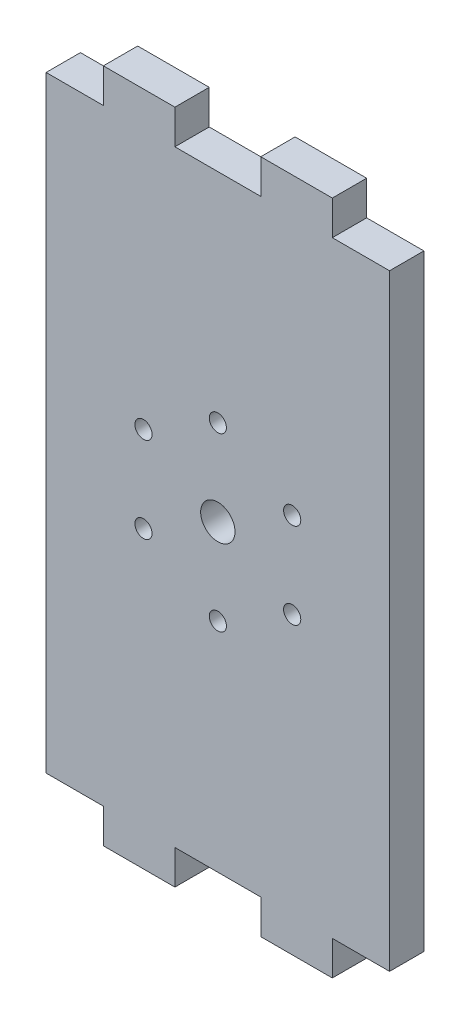
ISO-10303-21;
HEADER;
FILE_DESCRIPTION(('STEP AP214'),'2;1');
FILE_NAME('part.step','',(''),(''),'','','');
FILE_SCHEMA(('AUTOMOTIVE_DESIGN { 1 0 10303 214 1 1 1 1 }'));
ENDSEC;
DATA;
#1=APPLICATION_CONTEXT('core data for automotive mechanical design processes');
#2=APPLICATION_PROTOCOL_DEFINITION('international standard','automotive_design',2000,#1);
#3=PRODUCT_CONTEXT('',#1,'mechanical');
#4=PRODUCT('Part','Part','',(#3));
#5=PRODUCT_RELATED_PRODUCT_CATEGORY('part','',(#4));
#6=PRODUCT_DEFINITION_FORMATION('','',#4);
#7=PRODUCT_DEFINITION_CONTEXT('part definition',#1,'design');
#8=PRODUCT_DEFINITION('design','',#6,#7);
#9=PRODUCT_DEFINITION_SHAPE('','',#8);
#10=(LENGTH_UNIT() NAMED_UNIT(*) SI_UNIT(.MILLI.,.METRE.));
#11=(NAMED_UNIT(*) PLANE_ANGLE_UNIT() SI_UNIT($,.RADIAN.));
#12=(NAMED_UNIT(*) SI_UNIT($,.STERADIAN.) SOLID_ANGLE_UNIT());
#13=UNCERTAINTY_MEASURE_WITH_UNIT(LENGTH_MEASURE(1.E-05),#10,'distance_accuracy_value','');
#14=(GEOMETRIC_REPRESENTATION_CONTEXT(3) GLOBAL_UNCERTAINTY_ASSIGNED_CONTEXT((#13)) GLOBAL_UNIT_ASSIGNED_CONTEXT((#10,
#11,#12)) REPRESENTATION_CONTEXT('',''));
#15=CARTESIAN_POINT('',(0.,0.,0.));
#16=DIRECTION('',(0.,0.,1.));
#17=DIRECTION('',(1.,0.,0.));
#18=AXIS2_PLACEMENT_3D('',#15,#16,#17);
#19=CARTESIAN_POINT('',(0.,0.,3.));
#20=DIRECTION('',(0.,0.,1.));
#21=DIRECTION('',(1.,0.,0.));
#22=AXIS2_PLACEMENT_3D('',#19,#20,#21);
#23=PLANE('',#22);
#24=CARTESIAN_POINT('',(-6.49519052838329,-3.75,3.));
#25=DIRECTION('',(0.,0.,1.));
#26=DIRECTION('',(1.,0.,0.));
#27=AXIS2_PLACEMENT_3D('',#24,#25,#26);
#28=CIRCLE('',#27,0.750000000000066);
#29=CARTESIAN_POINT('',(-5.74519052838322,-3.75,3.));
#30=VERTEX_POINT('',#29);
#31=EDGE_CURVE('E406',#30,#30,#28,.T.);
#32=ORIENTED_EDGE('',*,*,#31,.F.);
#33=EDGE_LOOP('',(#32));
#34=FACE_BOUND('',#33,.T.);
#35=CARTESIAN_POINT('',(6.4951905283833,-3.74999999999999,3.));
#36=DIRECTION('',(0.,0.,1.));
#37=DIRECTION('',(1.,0.,0.));
#38=AXIS2_PLACEMENT_3D('',#35,#36,#37);
#39=CIRCLE('',#38,0.750000000000002);
#40=CARTESIAN_POINT('',(7.2451905283833,-3.74999999999999,3.));
#41=VERTEX_POINT('',#40);
#42=EDGE_CURVE('E418',#41,#41,#39,.T.);
#43=ORIENTED_EDGE('',*,*,#42,.F.);
#44=EDGE_LOOP('',(#43));
#45=FACE_BOUND('',#44,.T.);
#46=CARTESIAN_POINT('',(0.,0.,3.));
#47=DIRECTION('',(0.,0.,1.));
#48=DIRECTION('',(1.,0.,0.));
#49=AXIS2_PLACEMENT_3D('',#46,#47,#48);
#50=CIRCLE('',#49,1.5);
#51=CARTESIAN_POINT('',(1.5,0.,3.));
#52=VERTEX_POINT('',#51);
#53=EDGE_CURVE('E430',#52,#52,#50,.T.);
#54=ORIENTED_EDGE('',*,*,#53,.F.);
#55=EDGE_LOOP('',(#54));
#56=FACE_BOUND('',#55,.T.);
#57=DIRECTION('',(0.,-1.,0.));
#58=VECTOR('',#57,1.);
#59=CARTESIAN_POINT('',(-15.,26.5,3.));
#60=LINE('',#59,#58);
#61=CARTESIAN_POINT('',(-15.,26.5,3.));
#62=VERTEX_POINT('',#61);
#63=CARTESIAN_POINT('',(-15.,-26.5,3.));
#64=VERTEX_POINT('',#63);
#65=EDGE_CURVE('E240',#62,#64,#60,.T.);
#66=ORIENTED_EDGE('',*,*,#65,.T.);
#67=DIRECTION('',(1.,0.,0.));
#68=VECTOR('',#67,1.);
#69=CARTESIAN_POINT('',(-15.,-26.5,3.));
#70=LINE('',#69,#68);
#71=CARTESIAN_POINT('',(-10.,-26.5,3.));
#72=VERTEX_POINT('',#71);
#73=EDGE_CURVE('E128',#64,#72,#70,.T.);
#74=ORIENTED_EDGE('',*,*,#73,.T.);
#75=DIRECTION('',(0.,-1.,0.));
#76=VECTOR('',#75,1.);
#77=CARTESIAN_POINT('',(-10.,-26.5,3.));
#78=LINE('',#77,#76);
#79=CARTESIAN_POINT('',(-10.,-29.5,3.));
#80=VERTEX_POINT('',#79);
#81=EDGE_CURVE('E291',#72,#80,#78,.T.);
#82=ORIENTED_EDGE('',*,*,#81,.T.);
#83=DIRECTION('',(1.,0.,0.));
#84=VECTOR('',#83,1.);
#85=CARTESIAN_POINT('',(-10.,-29.5,3.));
#86=LINE('',#85,#84);
#87=CARTESIAN_POINT('',(-3.75,-29.5,3.));
#88=VERTEX_POINT('',#87);
#89=EDGE_CURVE('E310',#80,#88,#86,.T.);
#90=ORIENTED_EDGE('',*,*,#89,.T.);
#91=DIRECTION('',(0.,1.,0.));
#92=VECTOR('',#91,1.);
#93=CARTESIAN_POINT('',(-3.75,-29.5,3.));
#94=LINE('',#93,#92);
#95=CARTESIAN_POINT('',(-3.75,-26.5,3.));
#96=VERTEX_POINT('',#95);
#97=EDGE_CURVE('E307',#88,#96,#94,.T.);
#98=ORIENTED_EDGE('',*,*,#97,.T.);
#99=DIRECTION('',(1.,0.,0.));
#100=VECTOR('',#99,1.);
#101=CARTESIAN_POINT('',(-3.75,-26.5,3.));
#102=LINE('',#101,#100);
#103=CARTESIAN_POINT('',(3.75,-26.5,3.));
#104=VERTEX_POINT('',#103);
#105=EDGE_CURVE('E309',#96,#104,#102,.T.);
#106=ORIENTED_EDGE('',*,*,#105,.T.);
#107=DIRECTION('',(0.,-1.,0.));
#108=VECTOR('',#107,1.);
#109=CARTESIAN_POINT('',(3.75,-26.5,3.));
#110=LINE('',#109,#108);
#111=CARTESIAN_POINT('',(3.75,-29.5,3.));
#112=VERTEX_POINT('',#111);
#113=EDGE_CURVE('E312',#104,#112,#110,.T.);
#114=ORIENTED_EDGE('',*,*,#113,.T.);
#115=DIRECTION('',(1.,0.,0.));
#116=VECTOR('',#115,1.);
#117=CARTESIAN_POINT('',(3.75,-29.5,3.));
#118=LINE('',#117,#116);
#119=CARTESIAN_POINT('',(10.,-29.5,3.));
#120=VERTEX_POINT('',#119);
#121=EDGE_CURVE('E318',#112,#120,#118,.T.);
#122=ORIENTED_EDGE('',*,*,#121,.T.);
#123=DIRECTION('',(0.,1.,0.));
#124=VECTOR('',#123,1.);
#125=CARTESIAN_POINT('',(10.,-29.5,3.));
#126=LINE('',#125,#124);
#127=CARTESIAN_POINT('',(10.,-26.5,3.));
#128=VERTEX_POINT('',#127);
#129=EDGE_CURVE('E320',#120,#128,#126,.T.);
#130=ORIENTED_EDGE('',*,*,#129,.T.);
#131=DIRECTION('',(1.,0.,0.));
#132=VECTOR('',#131,1.);
#133=CARTESIAN_POINT('',(10.,-26.5,3.));
#134=LINE('',#133,#132);
#135=CARTESIAN_POINT('',(15.,-26.5,3.));
#136=VERTEX_POINT('',#135);
#137=EDGE_CURVE('E322',#128,#136,#134,.T.);
#138=ORIENTED_EDGE('',*,*,#137,.T.);
#139=DIRECTION('',(0.,1.,0.));
#140=VECTOR('',#139,1.);
#141=CARTESIAN_POINT('',(15.,26.5,3.));
#142=LINE('',#141,#140);
#143=CARTESIAN_POINT('',(15.,26.5,3.));
#144=VERTEX_POINT('',#143);
#145=EDGE_CURVE('E324',#136,#144,#142,.T.);
#146=ORIENTED_EDGE('',*,*,#145,.T.);
#147=DIRECTION('',(-1.,0.,0.));
#148=VECTOR('',#147,1.);
#149=CARTESIAN_POINT('',(10.,26.5,3.));
#150=LINE('',#149,#148);
#151=CARTESIAN_POINT('',(10.,26.5,3.));
#152=VERTEX_POINT('',#151);
#153=EDGE_CURVE('E326',#144,#152,#150,.T.);
#154=ORIENTED_EDGE('',*,*,#153,.T.);
#155=DIRECTION('',(0.,1.,0.));
#156=VECTOR('',#155,1.);
#157=CARTESIAN_POINT('',(10.,29.5,3.));
#158=LINE('',#157,#156);
#159=CARTESIAN_POINT('',(10.,29.5,3.));
#160=VERTEX_POINT('',#159);
#161=EDGE_CURVE('E328',#152,#160,#158,.T.);
#162=ORIENTED_EDGE('',*,*,#161,.T.);
#163=DIRECTION('',(-1.,0.,0.));
#164=VECTOR('',#163,1.);
#165=CARTESIAN_POINT('',(3.75,29.5,3.));
#166=LINE('',#165,#164);
#167=CARTESIAN_POINT('',(3.75,29.5,3.));
#168=VERTEX_POINT('',#167);
#169=EDGE_CURVE('E330',#160,#168,#166,.T.);
#170=ORIENTED_EDGE('',*,*,#169,.T.);
#171=DIRECTION('',(0.,-1.,0.));
#172=VECTOR('',#171,1.);
#173=CARTESIAN_POINT('',(3.75,26.5,3.));
#174=LINE('',#173,#172);
#175=CARTESIAN_POINT('',(3.75,26.5,3.));
#176=VERTEX_POINT('',#175);
#177=EDGE_CURVE('E332',#168,#176,#174,.T.);
#178=ORIENTED_EDGE('',*,*,#177,.T.);
#179=DIRECTION('',(-1.,0.,0.));
#180=VECTOR('',#179,1.);
#181=CARTESIAN_POINT('',(-3.75,26.5,3.));
#182=LINE('',#181,#180);
#183=CARTESIAN_POINT('',(-3.75,26.5,3.));
#184=VERTEX_POINT('',#183);
#185=EDGE_CURVE('E334',#176,#184,#182,.T.);
#186=ORIENTED_EDGE('',*,*,#185,.T.);
#187=DIRECTION('',(0.,1.,0.));
#188=VECTOR('',#187,1.);
#189=CARTESIAN_POINT('',(-3.75,29.5,3.));
#190=LINE('',#189,#188);
#191=CARTESIAN_POINT('',(-3.75,29.5,3.));
#192=VERTEX_POINT('',#191);
#193=EDGE_CURVE('E183',#184,#192,#190,.T.);
#194=ORIENTED_EDGE('',*,*,#193,.T.);
#195=DIRECTION('',(-1.,0.,0.));
#196=VECTOR('',#195,1.);
#197=CARTESIAN_POINT('',(-10.,29.5,3.));
#198=LINE('',#197,#196);
#199=CARTESIAN_POINT('',(-10.,29.5,3.));
#200=VERTEX_POINT('',#199);
#201=EDGE_CURVE('E177',#192,#200,#198,.T.);
#202=ORIENTED_EDGE('',*,*,#201,.T.);
#203=DIRECTION('',(0.,-1.,0.));
#204=VECTOR('',#203,1.);
#205=CARTESIAN_POINT('',(-10.,26.5,3.));
#206=LINE('',#205,#204);
#207=CARTESIAN_POINT('',(-10.,26.5,3.));
#208=VERTEX_POINT('',#207);
#209=EDGE_CURVE('E181',#200,#208,#206,.T.);
#210=ORIENTED_EDGE('',*,*,#209,.T.);
#211=DIRECTION('',(-1.,0.,0.));
#212=VECTOR('',#211,1.);
#213=CARTESIAN_POINT('',(-15.,26.5,3.));
#214=LINE('',#213,#212);
#215=EDGE_CURVE('E49',#208,#62,#214,.T.);
#216=ORIENTED_EDGE('',*,*,#215,.T.);
#217=EDGE_LOOP('',(#66,#74,#82,#90,#98,#106,#114,#122,#130,#138,#146,#154,#162,#170,#178,#186,
#194,#202,#210,#216));
#218=FACE_BOUND('',#217,.T.);
#219=CARTESIAN_POINT('',(0.,7.5,3.));
#220=DIRECTION('',(0.,0.,1.));
#221=DIRECTION('',(1.,0.,0.));
#222=AXIS2_PLACEMENT_3D('',#219,#220,#221);
#223=CIRCLE('',#222,0.750000000000086);
#224=CARTESIAN_POINT('',(0.750000000000086,7.5,3.));
#225=VERTEX_POINT('',#224);
#226=EDGE_CURVE('E205',#225,#225,#223,.T.);
#227=ORIENTED_EDGE('',*,*,#226,.F.);
#228=EDGE_LOOP('',(#227));
#229=FACE_BOUND('',#228,.T.);
#230=CARTESIAN_POINT('',(6.49519052838329,3.75000000000001,3.));
#231=DIRECTION('',(0.,0.,1.));
#232=DIRECTION('',(1.,0.,0.));
#233=AXIS2_PLACEMENT_3D('',#230,#231,#232);
#234=CIRCLE('',#233,0.750000000000064);
#235=CARTESIAN_POINT('',(7.24519052838335,3.75000000000001,3.));
#236=VERTEX_POINT('',#235);
#237=EDGE_CURVE('E424',#236,#236,#234,.T.);
#238=ORIENTED_EDGE('',*,*,#237,.F.);
#239=EDGE_LOOP('',(#238));
#240=FACE_BOUND('',#239,.T.);
#241=CARTESIAN_POINT('',(0.,-7.5,3.));
#242=DIRECTION('',(0.,0.,1.));
#243=DIRECTION('',(1.,0.,0.));
#244=AXIS2_PLACEMENT_3D('',#241,#242,#243);
#245=CIRCLE('',#244,0.750000000000001);
#246=CARTESIAN_POINT('',(0.750000000000024,-7.5,3.));
#247=VERTEX_POINT('',#246);
#248=EDGE_CURVE('E412',#247,#247,#245,.T.);
#249=ORIENTED_EDGE('',*,*,#248,.F.);
#250=EDGE_LOOP('',(#249));
#251=FACE_BOUND('',#250,.T.);
#252=CARTESIAN_POINT('',(-6.49519052838329,3.74999999999999,3.));
#253=DIRECTION('',(0.,0.,1.));
#254=DIRECTION('',(1.,0.,0.));
#255=AXIS2_PLACEMENT_3D('',#252,#253,#254);
#256=CIRCLE('',#255,0.750000000000002);
#257=CARTESIAN_POINT('',(-5.74519052838329,3.74999999999999,3.));
#258=VERTEX_POINT('',#257);
#259=EDGE_CURVE('E397',#258,#258,#256,.T.);
#260=ORIENTED_EDGE('',*,*,#259,.F.);
#261=EDGE_LOOP('',(#260));
#262=FACE_BOUND('',#261,.T.);
#263=ADVANCED_FACE('F32',(#34,#45,#56,#218,#229,#240,#251,#262),#23,.T.);
#264=CARTESIAN_POINT('',(0.,0.,0.));
#265=DIRECTION('',(0.,0.,1.));
#266=DIRECTION('',(1.,0.,0.));
#267=AXIS2_PLACEMENT_3D('',#264,#265,#266);
#268=PLANE('',#267);
#269=DIRECTION('',(0.,-1.,0.));
#270=VECTOR('',#269,1.);
#271=CARTESIAN_POINT('',(-15.,26.5,0.));
#272=LINE('',#271,#270);
#273=CARTESIAN_POINT('',(-15.,26.5,0.));
#274=VERTEX_POINT('',#273);
#275=CARTESIAN_POINT('',(-15.,-26.5,0.));
#276=VERTEX_POINT('',#275);
#277=EDGE_CURVE('E201',#274,#276,#272,.T.);
#278=ORIENTED_EDGE('',*,*,#277,.F.);
#279=DIRECTION('',(-1.,0.,0.));
#280=VECTOR('',#279,1.);
#281=CARTESIAN_POINT('',(-15.,26.5,0.));
#282=LINE('',#281,#280);
#283=CARTESIAN_POINT('',(-10.,26.5,0.));
#284=VERTEX_POINT('',#283);
#285=EDGE_CURVE('E120',#284,#274,#282,.T.);
#286=ORIENTED_EDGE('',*,*,#285,.F.);
#287=DIRECTION('',(0.,-1.,0.));
#288=VECTOR('',#287,1.);
#289=CARTESIAN_POINT('',(-10.,26.5,0.));
#290=LINE('',#289,#288);
#291=CARTESIAN_POINT('',(-10.,29.5,0.));
#292=VERTEX_POINT('',#291);
#293=EDGE_CURVE('E114',#292,#284,#290,.T.);
#294=ORIENTED_EDGE('',*,*,#293,.F.);
#295=DIRECTION('',(-1.,0.,0.));
#296=VECTOR('',#295,1.);
#297=CARTESIAN_POINT('',(-10.,29.5,0.));
#298=LINE('',#297,#296);
#299=CARTESIAN_POINT('',(-3.75,29.5,0.));
#300=VERTEX_POINT('',#299);
#301=EDGE_CURVE('E191',#300,#292,#298,.T.);
#302=ORIENTED_EDGE('',*,*,#301,.F.);
#303=DIRECTION('',(0.,1.,0.));
#304=VECTOR('',#303,1.);
#305=CARTESIAN_POINT('',(-3.75,29.5,0.));
#306=LINE('',#305,#304);
#307=CARTESIAN_POINT('',(-3.75,26.5,0.));
#308=VERTEX_POINT('',#307);
#309=EDGE_CURVE('E235',#308,#300,#306,.T.);
#310=ORIENTED_EDGE('',*,*,#309,.F.);
#311=DIRECTION('',(-1.,0.,0.));
#312=VECTOR('',#311,1.);
#313=CARTESIAN_POINT('',(-3.75,26.5,0.));
#314=LINE('',#313,#312);
#315=CARTESIAN_POINT('',(3.75,26.5,0.));
#316=VERTEX_POINT('',#315);
#317=EDGE_CURVE('E233',#316,#308,#314,.T.);
#318=ORIENTED_EDGE('',*,*,#317,.F.);
#319=DIRECTION('',(0.,-1.,0.));
#320=VECTOR('',#319,1.);
#321=CARTESIAN_POINT('',(3.75,26.5,0.));
#322=LINE('',#321,#320);
#323=CARTESIAN_POINT('',(3.75,29.5,0.));
#324=VERTEX_POINT('',#323);
#325=EDGE_CURVE('E231',#324,#316,#322,.T.);
#326=ORIENTED_EDGE('',*,*,#325,.F.);
#327=DIRECTION('',(-1.,0.,0.));
#328=VECTOR('',#327,1.);
#329=CARTESIAN_POINT('',(3.75,29.5,0.));
#330=LINE('',#329,#328);
#331=CARTESIAN_POINT('',(10.,29.5,0.));
#332=VERTEX_POINT('',#331);
#333=EDGE_CURVE('E229',#332,#324,#330,.T.);
#334=ORIENTED_EDGE('',*,*,#333,.F.);
#335=DIRECTION('',(0.,1.,0.));
#336=VECTOR('',#335,1.);
#337=CARTESIAN_POINT('',(10.,29.5,0.));
#338=LINE('',#337,#336);
#339=CARTESIAN_POINT('',(10.,26.5,0.));
#340=VERTEX_POINT('',#339);
#341=EDGE_CURVE('E227',#340,#332,#338,.T.);
#342=ORIENTED_EDGE('',*,*,#341,.F.);
#343=DIRECTION('',(-1.,0.,0.));
#344=VECTOR('',#343,1.);
#345=CARTESIAN_POINT('',(10.,26.5,0.));
#346=LINE('',#345,#344);
#347=CARTESIAN_POINT('',(15.,26.5,0.));
#348=VERTEX_POINT('',#347);
#349=EDGE_CURVE('E225',#348,#340,#346,.T.);
#350=ORIENTED_EDGE('',*,*,#349,.F.);
#351=DIRECTION('',(0.,1.,0.));
#352=VECTOR('',#351,1.);
#353=CARTESIAN_POINT('',(15.,26.5,0.));
#354=LINE('',#353,#352);
#355=CARTESIAN_POINT('',(15.,-26.5,0.));
#356=VERTEX_POINT('',#355);
#357=EDGE_CURVE('E223',#356,#348,#354,.T.);
#358=ORIENTED_EDGE('',*,*,#357,.F.);
#359=DIRECTION('',(1.,0.,0.));
#360=VECTOR('',#359,1.);
#361=CARTESIAN_POINT('',(10.,-26.5,0.));
#362=LINE('',#361,#360);
#363=CARTESIAN_POINT('',(10.,-26.5,0.));
#364=VERTEX_POINT('',#363);
#365=EDGE_CURVE('E221',#364,#356,#362,.T.);
#366=ORIENTED_EDGE('',*,*,#365,.F.);
#367=DIRECTION('',(0.,1.,0.));
#368=VECTOR('',#367,1.);
#369=CARTESIAN_POINT('',(10.,-29.5,0.));
#370=LINE('',#369,#368);
#371=CARTESIAN_POINT('',(10.,-29.5,0.));
#372=VERTEX_POINT('',#371);
#373=EDGE_CURVE('E219',#372,#364,#370,.T.);
#374=ORIENTED_EDGE('',*,*,#373,.F.);
#375=DIRECTION('',(1.,0.,0.));
#376=VECTOR('',#375,1.);
#377=CARTESIAN_POINT('',(3.75,-29.5,0.));
#378=LINE('',#377,#376);
#379=CARTESIAN_POINT('',(3.75,-29.5,0.));
#380=VERTEX_POINT('',#379);
#381=EDGE_CURVE('E217',#380,#372,#378,.T.);
#382=ORIENTED_EDGE('',*,*,#381,.F.);
#383=DIRECTION('',(0.,-1.,0.));
#384=VECTOR('',#383,1.);
#385=CARTESIAN_POINT('',(3.75,-26.5,0.));
#386=LINE('',#385,#384);
#387=CARTESIAN_POINT('',(3.75,-26.5,0.));
#388=VERTEX_POINT('',#387);
#389=EDGE_CURVE('E215',#388,#380,#386,.T.);
#390=ORIENTED_EDGE('',*,*,#389,.F.);
#391=DIRECTION('',(1.,0.,0.));
#392=VECTOR('',#391,1.);
#393=CARTESIAN_POINT('',(-3.75,-26.5,0.));
#394=LINE('',#393,#392);
#395=CARTESIAN_POINT('',(-3.75,-26.5,0.));
#396=VERTEX_POINT('',#395);
#397=EDGE_CURVE('E213',#396,#388,#394,.T.);
#398=ORIENTED_EDGE('',*,*,#397,.F.);
#399=DIRECTION('',(0.,1.,0.));
#400=VECTOR('',#399,1.);
#401=CARTESIAN_POINT('',(-3.75,-29.5,0.));
#402=LINE('',#401,#400);
#403=CARTESIAN_POINT('',(-3.75,-29.5,0.));
#404=VERTEX_POINT('',#403);
#405=EDGE_CURVE('E211',#404,#396,#402,.T.);
#406=ORIENTED_EDGE('',*,*,#405,.F.);
#407=DIRECTION('',(1.,0.,0.));
#408=VECTOR('',#407,1.);
#409=CARTESIAN_POINT('',(-10.,-29.5,0.));
#410=LINE('',#409,#408);
#411=CARTESIAN_POINT('',(-10.,-29.5,0.));
#412=VERTEX_POINT('',#411);
#413=EDGE_CURVE('E209',#412,#404,#410,.T.);
#414=ORIENTED_EDGE('',*,*,#413,.F.);
#415=DIRECTION('',(0.,-1.,0.));
#416=VECTOR('',#415,1.);
#417=CARTESIAN_POINT('',(-10.,-26.5,0.));
#418=LINE('',#417,#416);
#419=CARTESIAN_POINT('',(-10.,-26.5,0.));
#420=VERTEX_POINT('',#419);
#421=EDGE_CURVE('E207',#420,#412,#418,.T.);
#422=ORIENTED_EDGE('',*,*,#421,.F.);
#423=DIRECTION('',(1.,0.,0.));
#424=VECTOR('',#423,1.);
#425=CARTESIAN_POINT('',(-15.,-26.5,0.));
#426=LINE('',#425,#424);
#427=EDGE_CURVE('E204',#276,#420,#426,.T.);
#428=ORIENTED_EDGE('',*,*,#427,.F.);
#429=EDGE_LOOP('',(#278,#286,#294,#302,#310,#318,#326,#334,#342,#350,#358,#366,#374,#382,#390,
#398,#406,#414,#422,#428));
#430=FACE_BOUND('',#429,.T.);
#431=CARTESIAN_POINT('',(0.,7.5,0.));
#432=DIRECTION('',(0.,0.,1.));
#433=DIRECTION('',(1.,0.,0.));
#434=AXIS2_PLACEMENT_3D('',#431,#432,#433);
#435=CIRCLE('',#434,0.750000000000086);
#436=CARTESIAN_POINT('',(0.750000000000086,7.5,0.));
#437=VERTEX_POINT('',#436);
#438=EDGE_CURVE('E433',#437,#437,#435,.T.);
#439=ORIENTED_EDGE('',*,*,#438,.T.);
#440=EDGE_LOOP('',(#439));
#441=FACE_BOUND('',#440,.T.);
#442=CARTESIAN_POINT('',(0.,0.,0.));
#443=DIRECTION('',(0.,0.,1.));
#444=DIRECTION('',(1.,0.,0.));
#445=AXIS2_PLACEMENT_3D('',#442,#443,#444);
#446=CIRCLE('',#445,1.5);
#447=CARTESIAN_POINT('',(1.5,0.,0.));
#448=VERTEX_POINT('',#447);
#449=EDGE_CURVE('E427',#448,#448,#446,.T.);
#450=ORIENTED_EDGE('',*,*,#449,.T.);
#451=EDGE_LOOP('',(#450));
#452=FACE_BOUND('',#451,.T.);
#453=CARTESIAN_POINT('',(6.49519052838329,3.75000000000001,0.));
#454=DIRECTION('',(0.,0.,1.));
#455=DIRECTION('',(1.,0.,0.));
#456=AXIS2_PLACEMENT_3D('',#453,#454,#455);
#457=CIRCLE('',#456,0.750000000000064);
#458=CARTESIAN_POINT('',(7.24519052838335,3.75000000000001,0.));
#459=VERTEX_POINT('',#458);
#460=EDGE_CURVE('E421',#459,#459,#457,.T.);
#461=ORIENTED_EDGE('',*,*,#460,.T.);
#462=EDGE_LOOP('',(#461));
#463=FACE_BOUND('',#462,.T.);
#464=CARTESIAN_POINT('',(6.4951905283833,-3.74999999999999,0.));
#465=DIRECTION('',(0.,0.,1.));
#466=DIRECTION('',(1.,0.,0.));
#467=AXIS2_PLACEMENT_3D('',#464,#465,#466);
#468=CIRCLE('',#467,0.750000000000002);
#469=CARTESIAN_POINT('',(7.2451905283833,-3.74999999999999,0.));
#470=VERTEX_POINT('',#469);
#471=EDGE_CURVE('E415',#470,#470,#468,.T.);
#472=ORIENTED_EDGE('',*,*,#471,.T.);
#473=EDGE_LOOP('',(#472));
#474=FACE_BOUND('',#473,.T.);
#475=CARTESIAN_POINT('',(0.,-7.5,0.));
#476=DIRECTION('',(0.,0.,1.));
#477=DIRECTION('',(1.,0.,0.));
#478=AXIS2_PLACEMENT_3D('',#475,#476,#477);
#479=CIRCLE('',#478,0.750000000000001);
#480=CARTESIAN_POINT('',(0.750000000000024,-7.5,0.));
#481=VERTEX_POINT('',#480);
#482=EDGE_CURVE('E409',#481,#481,#479,.T.);
#483=ORIENTED_EDGE('',*,*,#482,.T.);
#484=EDGE_LOOP('',(#483));
#485=FACE_BOUND('',#484,.T.);
#486=CARTESIAN_POINT('',(-6.49519052838329,-3.75,0.));
#487=DIRECTION('',(0.,0.,1.));
#488=DIRECTION('',(1.,0.,0.));
#489=AXIS2_PLACEMENT_3D('',#486,#487,#488);
#490=CIRCLE('',#489,0.750000000000066);
#491=CARTESIAN_POINT('',(-5.74519052838322,-3.75,0.));
#492=VERTEX_POINT('',#491);
#493=EDGE_CURVE('E403',#492,#492,#490,.T.);
#494=ORIENTED_EDGE('',*,*,#493,.T.);
#495=EDGE_LOOP('',(#494));
#496=FACE_BOUND('',#495,.T.);
#497=CARTESIAN_POINT('',(-6.49519052838329,3.74999999999999,0.));
#498=DIRECTION('',(0.,0.,1.));
#499=DIRECTION('',(1.,0.,0.));
#500=AXIS2_PLACEMENT_3D('',#497,#498,#499);
#501=CIRCLE('',#500,0.750000000000002);
#502=CARTESIAN_POINT('',(-5.74519052838329,3.74999999999999,0.));
#503=VERTEX_POINT('',#502);
#504=EDGE_CURVE('E400',#503,#503,#501,.T.);
#505=ORIENTED_EDGE('',*,*,#504,.T.);
#506=EDGE_LOOP('',(#505));
#507=FACE_BOUND('',#506,.T.);
#508=ADVANCED_FACE('F295',(#430,#441,#452,#463,#474,#485,#496,#507),#268,.F.);
#509=CARTESIAN_POINT('',(-15.,26.5,3.));
#510=DIRECTION('',(1.,0.,0.));
#511=DIRECTION('',(0.,0.,-1.));
#512=AXIS2_PLACEMENT_3D('',#509,#510,#511);
#513=PLANE('',#512);
#514=ORIENTED_EDGE('',*,*,#277,.T.);
#515=DIRECTION('',(0.,0.,-1.));
#516=VECTOR('',#515,1.);
#517=CARTESIAN_POINT('',(-15.,-26.5,3.));
#518=LINE('',#517,#516);
#519=EDGE_CURVE('E11',#64,#276,#518,.T.);
#520=ORIENTED_EDGE('',*,*,#519,.F.);
#521=ORIENTED_EDGE('',*,*,#65,.F.);
#522=DIRECTION('',(0.,0.,-1.));
#523=VECTOR('',#522,1.);
#524=CARTESIAN_POINT('',(-15.,26.5,3.));
#525=LINE('',#524,#523);
#526=EDGE_CURVE('E197',#62,#274,#525,.T.);
#527=ORIENTED_EDGE('',*,*,#526,.T.);
#528=EDGE_LOOP('',(#514,#520,#521,#527));
#529=FACE_BOUND('',#528,.T.);
#530=ADVANCED_FACE('F34',(#529),#513,.F.);
#531=CARTESIAN_POINT('',(-15.,-26.5,3.));
#532=DIRECTION('',(0.,1.,0.));
#533=DIRECTION('',(0.,0.,1.));
#534=AXIS2_PLACEMENT_3D('',#531,#532,#533);
#535=PLANE('',#534);
#536=ORIENTED_EDGE('',*,*,#427,.T.);
#537=DIRECTION('',(0.,0.,-1.));
#538=VECTOR('',#537,1.);
#539=CARTESIAN_POINT('',(-10.,-26.5,3.));
#540=LINE('',#539,#538);
#541=EDGE_CURVE('E41',#72,#420,#540,.T.);
#542=ORIENTED_EDGE('',*,*,#541,.F.);
#543=ORIENTED_EDGE('',*,*,#73,.F.);
#544=ORIENTED_EDGE('',*,*,#519,.T.);
#545=EDGE_LOOP('',(#536,#542,#543,#544));
#546=FACE_BOUND('',#545,.T.);
#547=ADVANCED_FACE('F650',(#546),#535,.F.);
#548=CARTESIAN_POINT('',(-10.,-26.5,3.));
#549=DIRECTION('',(1.,0.,0.));
#550=DIRECTION('',(0.,0.,-1.));
#551=AXIS2_PLACEMENT_3D('',#548,#549,#550);
#552=PLANE('',#551);
#553=ORIENTED_EDGE('',*,*,#421,.T.);
#554=DIRECTION('',(0.,0.,-1.));
#555=VECTOR('',#554,1.);
#556=CARTESIAN_POINT('',(-10.,-29.5,3.));
#557=LINE('',#556,#555);
#558=EDGE_CURVE('E283',#80,#412,#557,.T.);
#559=ORIENTED_EDGE('',*,*,#558,.F.);
#560=ORIENTED_EDGE('',*,*,#81,.F.);
#561=ORIENTED_EDGE('',*,*,#541,.T.);
#562=EDGE_LOOP('',(#553,#559,#560,#561));
#563=FACE_BOUND('',#562,.T.);
#564=ADVANCED_FACE('F289',(#563),#552,.F.);
#565=CARTESIAN_POINT('',(-10.,-29.5,3.));
#566=DIRECTION('',(0.,1.,0.));
#567=DIRECTION('',(0.,0.,1.));
#568=AXIS2_PLACEMENT_3D('',#565,#566,#567);
#569=PLANE('',#568);
#570=ORIENTED_EDGE('',*,*,#413,.T.);
#571=DIRECTION('',(0.,0.,-1.));
#572=VECTOR('',#571,1.);
#573=CARTESIAN_POINT('',(-3.75,-29.5,3.));
#574=LINE('',#573,#572);
#575=EDGE_CURVE('E280',#88,#404,#574,.T.);
#576=ORIENTED_EDGE('',*,*,#575,.F.);
#577=ORIENTED_EDGE('',*,*,#89,.F.);
#578=ORIENTED_EDGE('',*,*,#558,.T.);
#579=EDGE_LOOP('',(#570,#576,#577,#578));
#580=FACE_BOUND('',#579,.T.);
#581=ADVANCED_FACE('F301',(#580),#569,.F.);
#582=CARTESIAN_POINT('',(-3.75,-29.5,3.));
#583=DIRECTION('',(-1.,0.,0.));
#584=DIRECTION('',(0.,-1.,0.));
#585=AXIS2_PLACEMENT_3D('',#582,#583,#584);
#586=PLANE('',#585);
#587=ORIENTED_EDGE('',*,*,#405,.T.);
#588=DIRECTION('',(0.,0.,-1.));
#589=VECTOR('',#588,1.);
#590=CARTESIAN_POINT('',(-3.75,-26.5,3.));
#591=LINE('',#590,#589);
#592=EDGE_CURVE('E277',#96,#396,#591,.T.);
#593=ORIENTED_EDGE('',*,*,#592,.F.);
#594=ORIENTED_EDGE('',*,*,#97,.F.);
#595=ORIENTED_EDGE('',*,*,#575,.T.);
#596=EDGE_LOOP('',(#587,#593,#594,#595));
#597=FACE_BOUND('',#596,.T.);
#598=ADVANCED_FACE('F305',(#597),#586,.F.);
#599=CARTESIAN_POINT('',(-3.75,-26.5,3.));
#600=DIRECTION('',(0.,1.,0.));
#601=DIRECTION('',(0.,0.,1.));
#602=AXIS2_PLACEMENT_3D('',#599,#600,#601);
#603=PLANE('',#602);
#604=ORIENTED_EDGE('',*,*,#397,.T.);
#605=DIRECTION('',(0.,0.,-1.));
#606=VECTOR('',#605,1.);
#607=CARTESIAN_POINT('',(3.75,-26.5,3.));
#608=LINE('',#607,#606);
#609=EDGE_CURVE('E274',#104,#388,#608,.T.);
#610=ORIENTED_EDGE('',*,*,#609,.F.);
#611=ORIENTED_EDGE('',*,*,#105,.F.);
#612=ORIENTED_EDGE('',*,*,#592,.T.);
#613=EDGE_LOOP('',(#604,#610,#611,#612));
#614=FACE_BOUND('',#613,.T.);
#615=ADVANCED_FACE('F615',(#614),#603,.F.);
#616=CARTESIAN_POINT('',(3.75,-26.5,3.));
#617=DIRECTION('',(1.,0.,0.));
#618=DIRECTION('',(0.,1.,0.));
#619=AXIS2_PLACEMENT_3D('',#616,#617,#618);
#620=PLANE('',#619);
#621=ORIENTED_EDGE('',*,*,#389,.T.);
#622=DIRECTION('',(0.,0.,-1.));
#623=VECTOR('',#622,1.);
#624=CARTESIAN_POINT('',(3.75,-29.5,3.));
#625=LINE('',#624,#623);
#626=EDGE_CURVE('E271',#112,#380,#625,.T.);
#627=ORIENTED_EDGE('',*,*,#626,.F.);
#628=ORIENTED_EDGE('',*,*,#113,.F.);
#629=ORIENTED_EDGE('',*,*,#609,.T.);
#630=EDGE_LOOP('',(#621,#627,#628,#629));
#631=FACE_BOUND('',#630,.T.);
#632=ADVANCED_FACE('F605',(#631),#620,.F.);
#633=CARTESIAN_POINT('',(3.75,-29.5,3.));
#634=DIRECTION('',(0.,1.,0.));
#635=DIRECTION('',(0.,0.,1.));
#636=AXIS2_PLACEMENT_3D('',#633,#634,#635);
#637=PLANE('',#636);
#638=ORIENTED_EDGE('',*,*,#381,.T.);
#639=DIRECTION('',(0.,0.,-1.));
#640=VECTOR('',#639,1.);
#641=CARTESIAN_POINT('',(10.,-29.5,3.));
#642=LINE('',#641,#640);
#643=EDGE_CURVE('E268',#120,#372,#642,.T.);
#644=ORIENTED_EDGE('',*,*,#643,.F.);
#645=ORIENTED_EDGE('',*,*,#121,.F.);
#646=ORIENTED_EDGE('',*,*,#626,.T.);
#647=EDGE_LOOP('',(#638,#644,#645,#646));
#648=FACE_BOUND('',#647,.T.);
#649=ADVANCED_FACE('F595',(#648),#637,.F.);
#650=CARTESIAN_POINT('',(10.,-29.5,3.));
#651=DIRECTION('',(-1.,0.,0.));
#652=DIRECTION('',(0.,0.,1.));
#653=AXIS2_PLACEMENT_3D('',#650,#651,#652);
#654=PLANE('',#653);
#655=ORIENTED_EDGE('',*,*,#373,.T.);
#656=DIRECTION('',(0.,0.,-1.));
#657=VECTOR('',#656,1.);
#658=CARTESIAN_POINT('',(10.,-26.5,3.));
#659=LINE('',#658,#657);
#660=EDGE_CURVE('E265',#128,#364,#659,.T.);
#661=ORIENTED_EDGE('',*,*,#660,.F.);
#662=ORIENTED_EDGE('',*,*,#129,.F.);
#663=ORIENTED_EDGE('',*,*,#643,.T.);
#664=EDGE_LOOP('',(#655,#661,#662,#663));
#665=FACE_BOUND('',#664,.T.);
#666=ADVANCED_FACE('F585',(#665),#654,.F.);
#667=CARTESIAN_POINT('',(10.,-26.5,3.));
#668=DIRECTION('',(0.,1.,0.));
#669=DIRECTION('',(0.,0.,1.));
#670=AXIS2_PLACEMENT_3D('',#667,#668,#669);
#671=PLANE('',#670);
#672=ORIENTED_EDGE('',*,*,#365,.T.);
#673=DIRECTION('',(0.,0.,-1.));
#674=VECTOR('',#673,1.);
#675=CARTESIAN_POINT('',(15.,-26.5,3.));
#676=LINE('',#675,#674);
#677=EDGE_CURVE('E262',#136,#356,#676,.T.);
#678=ORIENTED_EDGE('',*,*,#677,.F.);
#679=ORIENTED_EDGE('',*,*,#137,.F.);
#680=ORIENTED_EDGE('',*,*,#660,.T.);
#681=EDGE_LOOP('',(#672,#678,#679,#680));
#682=FACE_BOUND('',#681,.T.);
#683=ADVANCED_FACE('F575',(#682),#671,.F.);
#684=CARTESIAN_POINT('',(15.,26.5,3.));
#685=DIRECTION('',(-1.,0.,0.));
#686=DIRECTION('',(0.,0.,1.));
#687=AXIS2_PLACEMENT_3D('',#684,#685,#686);
#688=PLANE('',#687);
#689=ORIENTED_EDGE('',*,*,#357,.T.);
#690=DIRECTION('',(0.,0.,-1.));
#691=VECTOR('',#690,1.);
#692=CARTESIAN_POINT('',(15.,26.5,3.));
#693=LINE('',#692,#691);
#694=EDGE_CURVE('E259',#144,#348,#693,.T.);
#695=ORIENTED_EDGE('',*,*,#694,.F.);
#696=ORIENTED_EDGE('',*,*,#145,.F.);
#697=ORIENTED_EDGE('',*,*,#677,.T.);
#698=EDGE_LOOP('',(#689,#695,#696,#697));
#699=FACE_BOUND('',#698,.T.);
#700=ADVANCED_FACE('F565',(#699),#688,.F.);
#701=CARTESIAN_POINT('',(10.,26.5,3.));
#702=DIRECTION('',(0.,-1.,0.));
#703=DIRECTION('',(0.,0.,-1.));
#704=AXIS2_PLACEMENT_3D('',#701,#702,#703);
#705=PLANE('',#704);
#706=ORIENTED_EDGE('',*,*,#349,.T.);
#707=DIRECTION('',(0.,0.,-1.));
#708=VECTOR('',#707,1.);
#709=CARTESIAN_POINT('',(10.,26.5,3.));
#710=LINE('',#709,#708);
#711=EDGE_CURVE('E256',#152,#340,#710,.T.);
#712=ORIENTED_EDGE('',*,*,#711,.F.);
#713=ORIENTED_EDGE('',*,*,#153,.F.);
#714=ORIENTED_EDGE('',*,*,#694,.T.);
#715=EDGE_LOOP('',(#706,#712,#713,#714));
#716=FACE_BOUND('',#715,.T.);
#717=ADVANCED_FACE('F555',(#716),#705,.F.);
#718=CARTESIAN_POINT('',(10.,29.5,3.));
#719=DIRECTION('',(-1.,0.,0.));
#720=DIRECTION('',(0.,0.,1.));
#721=AXIS2_PLACEMENT_3D('',#718,#719,#720);
#722=PLANE('',#721);
#723=ORIENTED_EDGE('',*,*,#341,.T.);
#724=DIRECTION('',(0.,0.,-1.));
#725=VECTOR('',#724,1.);
#726=CARTESIAN_POINT('',(10.,29.5,3.));
#727=LINE('',#726,#725);
#728=EDGE_CURVE('E253',#160,#332,#727,.T.);
#729=ORIENTED_EDGE('',*,*,#728,.F.);
#730=ORIENTED_EDGE('',*,*,#161,.F.);
#731=ORIENTED_EDGE('',*,*,#711,.T.);
#732=EDGE_LOOP('',(#723,#729,#730,#731));
#733=FACE_BOUND('',#732,.T.);
#734=ADVANCED_FACE('F545',(#733),#722,.F.);
#735=CARTESIAN_POINT('',(3.75,29.5,3.));
#736=DIRECTION('',(0.,-1.,0.));
#737=DIRECTION('',(0.,0.,-1.));
#738=AXIS2_PLACEMENT_3D('',#735,#736,#737);
#739=PLANE('',#738);
#740=ORIENTED_EDGE('',*,*,#333,.T.);
#741=DIRECTION('',(0.,0.,-1.));
#742=VECTOR('',#741,1.);
#743=CARTESIAN_POINT('',(3.75,29.5,3.));
#744=LINE('',#743,#742);
#745=EDGE_CURVE('E250',#168,#324,#744,.T.);
#746=ORIENTED_EDGE('',*,*,#745,.F.);
#747=ORIENTED_EDGE('',*,*,#169,.F.);
#748=ORIENTED_EDGE('',*,*,#728,.T.);
#749=EDGE_LOOP('',(#740,#746,#747,#748));
#750=FACE_BOUND('',#749,.T.);
#751=ADVANCED_FACE('F535',(#750),#739,.F.);
#752=CARTESIAN_POINT('',(3.75,26.5,3.));
#753=DIRECTION('',(1.,0.,0.));
#754=DIRECTION('',(0.,1.,0.));
#755=AXIS2_PLACEMENT_3D('',#752,#753,#754);
#756=PLANE('',#755);
#757=ORIENTED_EDGE('',*,*,#325,.T.);
#758=DIRECTION('',(0.,0.,-1.));
#759=VECTOR('',#758,1.);
#760=CARTESIAN_POINT('',(3.75,26.5,3.));
#761=LINE('',#760,#759);
#762=EDGE_CURVE('E247',#176,#316,#761,.T.);
#763=ORIENTED_EDGE('',*,*,#762,.F.);
#764=ORIENTED_EDGE('',*,*,#177,.F.);
#765=ORIENTED_EDGE('',*,*,#745,.T.);
#766=EDGE_LOOP('',(#757,#763,#764,#765));
#767=FACE_BOUND('',#766,.T.);
#768=ADVANCED_FACE('F526',(#767),#756,.F.);
#769=CARTESIAN_POINT('',(-3.75,26.5,3.));
#770=DIRECTION('',(0.,-1.,0.));
#771=DIRECTION('',(0.,0.,-1.));
#772=AXIS2_PLACEMENT_3D('',#769,#770,#771);
#773=PLANE('',#772);
#774=ORIENTED_EDGE('',*,*,#317,.T.);
#775=DIRECTION('',(0.,0.,-1.));
#776=VECTOR('',#775,1.);
#777=CARTESIAN_POINT('',(-3.75,26.5,3.));
#778=LINE('',#777,#776);
#779=EDGE_CURVE('E244',#184,#308,#778,.T.);
#780=ORIENTED_EDGE('',*,*,#779,.F.);
#781=ORIENTED_EDGE('',*,*,#185,.F.);
#782=ORIENTED_EDGE('',*,*,#762,.T.);
#783=EDGE_LOOP('',(#774,#780,#781,#782));
#784=FACE_BOUND('',#783,.T.);
#785=ADVANCED_FACE('F340',(#784),#773,.F.);
#786=CARTESIAN_POINT('',(-3.75,29.5,3.));
#787=DIRECTION('',(-1.,0.,0.));
#788=DIRECTION('',(0.,-1.,0.));
#789=AXIS2_PLACEMENT_3D('',#786,#787,#788);
#790=PLANE('',#789);
#791=ORIENTED_EDGE('',*,*,#309,.T.);
#792=DIRECTION('',(0.,0.,-1.));
#793=VECTOR('',#792,1.);
#794=CARTESIAN_POINT('',(-3.75,29.5,3.));
#795=LINE('',#794,#793);
#796=EDGE_CURVE('E192',#192,#300,#795,.T.);
#797=ORIENTED_EDGE('',*,*,#796,.F.);
#798=ORIENTED_EDGE('',*,*,#193,.F.);
#799=ORIENTED_EDGE('',*,*,#779,.T.);
#800=EDGE_LOOP('',(#791,#797,#798,#799));
#801=FACE_BOUND('',#800,.T.);
#802=ADVANCED_FACE('F344',(#801),#790,.F.);
#803=CARTESIAN_POINT('',(-10.,29.5,3.));
#804=DIRECTION('',(0.,-1.,0.));
#805=DIRECTION('',(0.,0.,-1.));
#806=AXIS2_PLACEMENT_3D('',#803,#804,#805);
#807=PLANE('',#806);
#808=ORIENTED_EDGE('',*,*,#301,.T.);
#809=DIRECTION('',(0.,0.,-1.));
#810=VECTOR('',#809,1.);
#811=CARTESIAN_POINT('',(-10.,29.5,3.));
#812=LINE('',#811,#810);
#813=EDGE_CURVE('E188',#200,#292,#812,.T.);
#814=ORIENTED_EDGE('',*,*,#813,.F.);
#815=ORIENTED_EDGE('',*,*,#201,.F.);
#816=ORIENTED_EDGE('',*,*,#796,.T.);
#817=EDGE_LOOP('',(#808,#814,#815,#816));
#818=FACE_BOUND('',#817,.T.);
#819=ADVANCED_FACE('F189',(#818),#807,.F.);
#820=CARTESIAN_POINT('',(-10.,26.5,3.));
#821=DIRECTION('',(1.,0.,0.));
#822=DIRECTION('',(0.,0.,-1.));
#823=AXIS2_PLACEMENT_3D('',#820,#821,#822);
#824=PLANE('',#823);
#825=ORIENTED_EDGE('',*,*,#293,.T.);
#826=DIRECTION('',(0.,0.,-1.));
#827=VECTOR('',#826,1.);
#828=CARTESIAN_POINT('',(-10.,26.5,3.));
#829=LINE('',#828,#827);
#830=EDGE_CURVE('E193',#208,#284,#829,.T.);
#831=ORIENTED_EDGE('',*,*,#830,.F.);
#832=ORIENTED_EDGE('',*,*,#209,.F.);
#833=ORIENTED_EDGE('',*,*,#813,.T.);
#834=EDGE_LOOP('',(#825,#831,#832,#833));
#835=FACE_BOUND('',#834,.T.);
#836=ADVANCED_FACE('F195',(#835),#824,.F.);
#837=CARTESIAN_POINT('',(-15.,26.5,3.));
#838=DIRECTION('',(0.,-1.,0.));
#839=DIRECTION('',(0.,0.,-1.));
#840=AXIS2_PLACEMENT_3D('',#837,#838,#839);
#841=PLANE('',#840);
#842=ORIENTED_EDGE('',*,*,#285,.T.);
#843=ORIENTED_EDGE('',*,*,#526,.F.);
#844=ORIENTED_EDGE('',*,*,#215,.F.);
#845=ORIENTED_EDGE('',*,*,#830,.T.);
#846=EDGE_LOOP('',(#842,#843,#844,#845));
#847=FACE_BOUND('',#846,.T.);
#848=ADVANCED_FACE('F348',(#847),#841,.F.);
#849=CARTESIAN_POINT('',(0.,7.5,3.));
#850=DIRECTION('',(0.,0.,-1.));
#851=DIRECTION('',(-1.,0.,0.));
#852=AXIS2_PLACEMENT_3D('',#849,#850,#851);
#853=CYLINDRICAL_SURFACE('',#852,0.750000000000086);
#854=ORIENTED_EDGE('',*,*,#226,.T.);
#855=EDGE_LOOP('',(#854));
#856=FACE_BOUND('',#855,.T.);
#857=ORIENTED_EDGE('',*,*,#438,.F.);
#858=EDGE_LOOP('',(#857));
#859=FACE_BOUND('',#858,.T.);
#860=ADVANCED_FACE('F350',(#856,#859),#853,.F.);
#861=CARTESIAN_POINT('',(0.,0.,3.));
#862=DIRECTION('',(0.,0.,-1.));
#863=DIRECTION('',(-1.,0.,0.));
#864=AXIS2_PLACEMENT_3D('',#861,#862,#863);
#865=CYLINDRICAL_SURFACE('',#864,1.5);
#866=ORIENTED_EDGE('',*,*,#53,.T.);
#867=EDGE_LOOP('',(#866));
#868=FACE_BOUND('',#867,.T.);
#869=ORIENTED_EDGE('',*,*,#449,.F.);
#870=EDGE_LOOP('',(#869));
#871=FACE_BOUND('',#870,.T.);
#872=ADVANCED_FACE('F356',(#868,#871),#865,.F.);
#873=CARTESIAN_POINT('',(6.49519052838329,3.75000000000001,3.));
#874=DIRECTION('',(0.,0.,-1.));
#875=DIRECTION('',(-1.,0.,0.));
#876=AXIS2_PLACEMENT_3D('',#873,#874,#875);
#877=CYLINDRICAL_SURFACE('',#876,0.750000000000064);
#878=ORIENTED_EDGE('',*,*,#237,.T.);
#879=EDGE_LOOP('',(#878));
#880=FACE_BOUND('',#879,.T.);
#881=ORIENTED_EDGE('',*,*,#460,.F.);
#882=EDGE_LOOP('',(#881));
#883=FACE_BOUND('',#882,.T.);
#884=ADVANCED_FACE('F372',(#880,#883),#877,.F.);
#885=CARTESIAN_POINT('',(6.4951905283833,-3.74999999999999,3.));
#886=DIRECTION('',(0.,0.,-1.));
#887=DIRECTION('',(-1.,0.,0.));
#888=AXIS2_PLACEMENT_3D('',#885,#886,#887);
#889=CYLINDRICAL_SURFACE('',#888,0.750000000000002);
#890=ORIENTED_EDGE('',*,*,#42,.T.);
#891=EDGE_LOOP('',(#890));
#892=FACE_BOUND('',#891,.T.);
#893=ORIENTED_EDGE('',*,*,#471,.F.);
#894=EDGE_LOOP('',(#893));
#895=FACE_BOUND('',#894,.T.);
#896=ADVANCED_FACE('F376',(#892,#895),#889,.F.);
#897=CARTESIAN_POINT('',(0.,-7.5,3.));
#898=DIRECTION('',(0.,0.,-1.));
#899=DIRECTION('',(-1.,0.,0.));
#900=AXIS2_PLACEMENT_3D('',#897,#898,#899);
#901=CYLINDRICAL_SURFACE('',#900,0.750000000000001);
#902=ORIENTED_EDGE('',*,*,#248,.T.);
#903=EDGE_LOOP('',(#902));
#904=FACE_BOUND('',#903,.T.);
#905=ORIENTED_EDGE('',*,*,#482,.F.);
#906=EDGE_LOOP('',(#905));
#907=FACE_BOUND('',#906,.T.);
#908=ADVANCED_FACE('F380',(#904,#907),#901,.F.);
#909=CARTESIAN_POINT('',(-6.49519052838329,-3.75,3.));
#910=DIRECTION('',(0.,0.,-1.));
#911=DIRECTION('',(-1.,0.,0.));
#912=AXIS2_PLACEMENT_3D('',#909,#910,#911);
#913=CYLINDRICAL_SURFACE('',#912,0.750000000000066);
#914=ORIENTED_EDGE('',*,*,#31,.T.);
#915=EDGE_LOOP('',(#914));
#916=FACE_BOUND('',#915,.T.);
#917=ORIENTED_EDGE('',*,*,#493,.F.);
#918=EDGE_LOOP('',(#917));
#919=FACE_BOUND('',#918,.T.);
#920=ADVANCED_FACE('F384',(#916,#919),#913,.F.);
#921=CARTESIAN_POINT('',(-6.49519052838329,3.74999999999999,3.));
#922=DIRECTION('',(0.,0.,-1.));
#923=DIRECTION('',(-1.,0.,0.));
#924=AXIS2_PLACEMENT_3D('',#921,#922,#923);
#925=CYLINDRICAL_SURFACE('',#924,0.750000000000002);
#926=ORIENTED_EDGE('',*,*,#259,.T.);
#927=EDGE_LOOP('',(#926));
#928=FACE_BOUND('',#927,.T.);
#929=ORIENTED_EDGE('',*,*,#504,.F.);
#930=EDGE_LOOP('',(#929));
#931=FACE_BOUND('',#930,.T.);
#932=ADVANCED_FACE('F388',(#928,#931),#925,.F.);
#933=CLOSED_SHELL('',(#263,#508,#530,#547,#564,#581,#598,#615,#632,#649,#666,#683,#700,#717,
#734,#751,#768,#785,#802,#819,#836,#848,#860,#872,#884,#896,#908,#920,#932));
#934=MANIFOLD_SOLID_BREP('B2',#933);
#935=ADVANCED_BREP_SHAPE_REPRESENTATION('',(#18,#934),#14);
#936=SHAPE_DEFINITION_REPRESENTATION(#9,#935);
ENDSEC;
END-ISO-10303-21;
